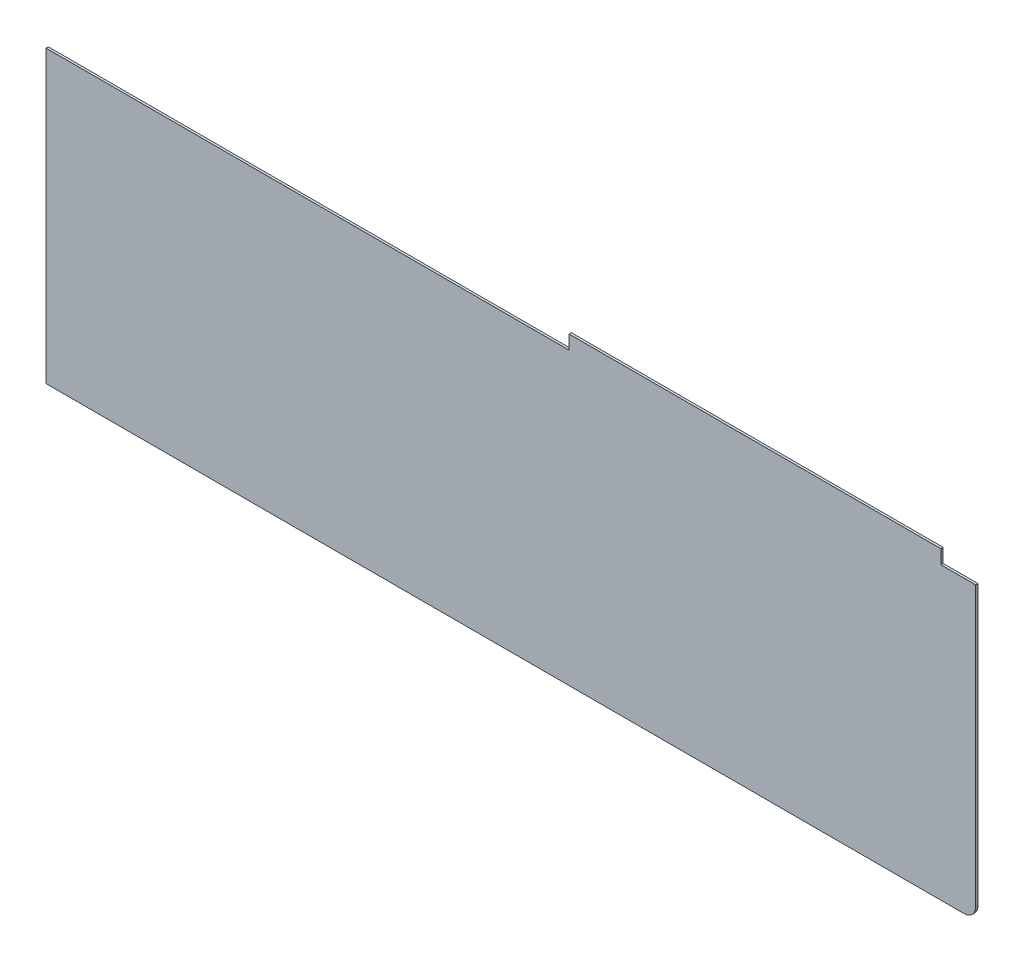
ISO-10303-21;
HEADER;
FILE_DESCRIPTION(('STEP AP214'),'2;1');
FILE_NAME('part.step','',(''),(''),'','','');
FILE_SCHEMA(('AUTOMOTIVE_DESIGN { 1 0 10303 214 1 1 1 1 }'));
ENDSEC;
DATA;
#1=APPLICATION_CONTEXT('core data for automotive mechanical design processes');
#2=APPLICATION_PROTOCOL_DEFINITION('international standard','automotive_design',2000,#1);
#3=PRODUCT_CONTEXT('',#1,'mechanical');
#4=PRODUCT('Part','Part','',(#3));
#5=PRODUCT_RELATED_PRODUCT_CATEGORY('part','',(#4));
#6=PRODUCT_DEFINITION_FORMATION('','',#4);
#7=PRODUCT_DEFINITION_CONTEXT('part definition',#1,'design');
#8=PRODUCT_DEFINITION('design','',#6,#7);
#9=PRODUCT_DEFINITION_SHAPE('','',#8);
#10=(LENGTH_UNIT() NAMED_UNIT(*) SI_UNIT(.MILLI.,.METRE.));
#11=(NAMED_UNIT(*) PLANE_ANGLE_UNIT() SI_UNIT($,.RADIAN.));
#12=(NAMED_UNIT(*) SI_UNIT($,.STERADIAN.) SOLID_ANGLE_UNIT());
#13=UNCERTAINTY_MEASURE_WITH_UNIT(LENGTH_MEASURE(1.E-05),#10,'distance_accuracy_value','');
#14=(GEOMETRIC_REPRESENTATION_CONTEXT(3) GLOBAL_UNCERTAINTY_ASSIGNED_CONTEXT((#13)) GLOBAL_UNIT_ASSIGNED_CONTEXT((#10,
#11,#12)) REPRESENTATION_CONTEXT('',''));
#15=CARTESIAN_POINT('',(0.,0.,0.));
#16=DIRECTION('',(0.,0.,1.));
#17=DIRECTION('',(1.,0.,0.));
#18=AXIS2_PLACEMENT_3D('',#15,#16,#17);
#19=CARTESIAN_POINT('',(-59.2830286329051,4.15023543117741,0.2));
#20=DIRECTION('',(0.,0.,1.));
#21=DIRECTION('',(1.,0.,0.));
#22=AXIS2_PLACEMENT_3D('',#19,#20,#21);
#23=PLANE('',#22);
#24=DIRECTION('',(1.,0.,0.));
#25=VECTOR('',#24,1.);
#26=CARTESIAN_POINT('',(-14.2830286329051,4.15023543117741,0.2));
#27=LINE('',#26,#25);
#28=CARTESIAN_POINT('',(-14.2830286329051,4.15023543117741,0.2));
#29=VERTEX_POINT('',#28);
#30=CARTESIAN_POINT('',(-59.2830286329051,4.15023543117741,0.2));
#31=VERTEX_POINT('',#30);
#32=EDGE_CURVE('E127',#29,#31,#27,.F.);
#33=ORIENTED_EDGE('',*,*,#32,.T.);
#34=DIRECTION('',(0.,1.,0.));
#35=VECTOR('',#34,1.);
#36=CARTESIAN_POINT('',(-59.2830286329051,4.15023543117741,0.2));
#37=LINE('',#36,#35);
#38=CARTESIAN_POINT('',(-59.2830286329051,-20.8497645688226,0.2));
#39=VERTEX_POINT('',#38);
#40=EDGE_CURVE('E103',#31,#39,#37,.F.);
#41=ORIENTED_EDGE('',*,*,#40,.T.);
#42=DIRECTION('',(1.,0.,0.));
#43=VECTOR('',#42,1.);
#44=CARTESIAN_POINT('',(-59.2830286329051,-20.8497645688226,0.2));
#45=LINE('',#44,#43);
#46=CARTESIAN_POINT('',(19.7169713670949,-20.8497645688226,0.2));
#47=VERTEX_POINT('',#46);
#48=EDGE_CURVE('E99',#39,#47,#45,.T.);
#49=ORIENTED_EDGE('',*,*,#48,.T.);
#50=CARTESIAN_POINT('',(19.7169713670949,-19.8497645688226,0.2));
#51=DIRECTION('',(0.,0.,-1.));
#52=DIRECTION('',(-1.,0.,0.));
#53=AXIS2_PLACEMENT_3D('',#50,#51,#52);
#54=CIRCLE('',#53,1.);
#55=CARTESIAN_POINT('',(20.7169713670949,-19.8497645688226,0.2));
#56=VERTEX_POINT('',#55);
#57=EDGE_CURVE('E19',#56,#47,#54,.T.);
#58=ORIENTED_EDGE('',*,*,#57,.F.);
#59=DIRECTION('',(0.,-1.,0.));
#60=VECTOR('',#59,1.);
#61=CARTESIAN_POINT('',(20.7169713670949,4.15023543117741,0.2));
#62=LINE('',#61,#60);
#63=CARTESIAN_POINT('',(20.7169713670949,4.15023543117741,0.2));
#64=VERTEX_POINT('',#63);
#65=EDGE_CURVE('E169',#56,#64,#62,.F.);
#66=ORIENTED_EDGE('',*,*,#65,.T.);
#67=DIRECTION('',(1.,0.,0.));
#68=VECTOR('',#67,1.);
#69=CARTESIAN_POINT('',(20.7169713670949,4.15023543117741,0.2));
#70=LINE('',#69,#68);
#71=CARTESIAN_POINT('',(17.7169713670949,4.15023543117741,0.2));
#72=VERTEX_POINT('',#71);
#73=EDGE_CURVE('E55',#64,#72,#70,.F.);
#74=ORIENTED_EDGE('',*,*,#73,.T.);
#75=DIRECTION('',(0.,1.,0.));
#76=VECTOR('',#75,1.);
#77=CARTESIAN_POINT('',(17.7169713670949,4.15023543117741,0.2));
#78=LINE('',#77,#76);
#79=CARTESIAN_POINT('',(17.7169713670949,5.35023543117741,0.2));
#80=VERTEX_POINT('',#79);
#81=EDGE_CURVE('E157',#72,#80,#78,.T.);
#82=ORIENTED_EDGE('',*,*,#81,.T.);
#83=DIRECTION('',(1.,0.,0.));
#84=VECTOR('',#83,1.);
#85=CARTESIAN_POINT('',(17.7169713670949,5.35023543117741,0.2));
#86=LINE('',#85,#84);
#87=CARTESIAN_POINT('',(-14.2830286329051,5.3502354311774,0.2));
#88=VERTEX_POINT('',#87);
#89=EDGE_CURVE('E146',#80,#88,#86,.F.);
#90=ORIENTED_EDGE('',*,*,#89,.T.);
#91=DIRECTION('',(0.,1.,0.));
#92=VECTOR('',#91,1.);
#93=CARTESIAN_POINT('',(-14.2830286329051,4.15023543117741,0.2));
#94=LINE('',#93,#92);
#95=EDGE_CURVE('E135',#88,#29,#94,.F.);
#96=ORIENTED_EDGE('',*,*,#95,.T.);
#97=EDGE_LOOP('',(#33,#41,#49,#58,#66,#74,#82,#90,#96));
#98=FACE_BOUND('',#97,.T.);
#99=ADVANCED_FACE('F16',(#98),#23,.T.);
#100=CARTESIAN_POINT('',(20.7169713670949,4.15023543117741,0.2));
#101=DIRECTION('',(0.,-1.,0.));
#102=DIRECTION('',(0.,0.,-1.));
#103=AXIS2_PLACEMENT_3D('',#100,#101,#102);
#104=PLANE('',#103);
#105=DIRECTION('',(0.,0.,1.));
#106=VECTOR('',#105,1.);
#107=CARTESIAN_POINT('',(17.7169713670949,4.15023543117741,0.2));
#108=LINE('',#107,#106);
#109=CARTESIAN_POINT('',(17.7169713670949,4.15023543117741,0.));
#110=VERTEX_POINT('',#109);
#111=EDGE_CURVE('E165',#110,#72,#108,.T.);
#112=ORIENTED_EDGE('',*,*,#111,.T.);
#113=ORIENTED_EDGE('',*,*,#73,.F.);
#114=DIRECTION('',(0.,0.,1.));
#115=VECTOR('',#114,1.);
#116=CARTESIAN_POINT('',(20.7169713670949,4.15023543117741,0.2));
#117=LINE('',#116,#115);
#118=CARTESIAN_POINT('',(20.7169713670949,4.15023543117741,0.));
#119=VERTEX_POINT('',#118);
#120=EDGE_CURVE('E196',#64,#119,#117,.F.);
#121=ORIENTED_EDGE('',*,*,#120,.T.);
#122=DIRECTION('',(1.,0.,0.));
#123=VECTOR('',#122,1.);
#124=CARTESIAN_POINT('',(-59.2830286329051,4.15023543117741,0.));
#125=LINE('',#124,#123);
#126=EDGE_CURVE('E162',#119,#110,#125,.F.);
#127=ORIENTED_EDGE('',*,*,#126,.T.);
#128=EDGE_LOOP('',(#112,#113,#121,#127));
#129=FACE_BOUND('',#128,.T.);
#130=ADVANCED_FACE('F210',(#129),#104,.F.);
#131=CARTESIAN_POINT('',(17.7169713670949,4.15023543117741,0.2));
#132=DIRECTION('',(-1.,0.,0.));
#133=DIRECTION('',(0.,0.,1.));
#134=AXIS2_PLACEMENT_3D('',#131,#132,#133);
#135=PLANE('',#134);
#136=DIRECTION('',(0.,0.,1.));
#137=VECTOR('',#136,1.);
#138=CARTESIAN_POINT('',(17.7169713670949,5.35023543117741,0.2));
#139=LINE('',#138,#137);
#140=CARTESIAN_POINT('',(17.7169713670949,5.35023543117741,0.));
#141=VERTEX_POINT('',#140);
#142=EDGE_CURVE('E154',#141,#80,#139,.T.);
#143=ORIENTED_EDGE('',*,*,#142,.T.);
#144=ORIENTED_EDGE('',*,*,#81,.F.);
#145=ORIENTED_EDGE('',*,*,#111,.F.);
#146=DIRECTION('',(0.,1.,0.));
#147=VECTOR('',#146,1.);
#148=CARTESIAN_POINT('',(17.7169713670949,4.15023543117741,0.));
#149=LINE('',#148,#147);
#150=EDGE_CURVE('E151',#110,#141,#149,.T.);
#151=ORIENTED_EDGE('',*,*,#150,.T.);
#152=EDGE_LOOP('',(#143,#144,#145,#151));
#153=FACE_BOUND('',#152,.T.);
#154=ADVANCED_FACE('F215',(#153),#135,.F.);
#155=CARTESIAN_POINT('',(17.7169713670949,5.35023543117741,0.2));
#156=DIRECTION('',(0.,-1.,0.));
#157=DIRECTION('',(1.,0.,0.));
#158=AXIS2_PLACEMENT_3D('',#155,#156,#157);
#159=PLANE('',#158);
#160=DIRECTION('',(0.,0.,-1.));
#161=VECTOR('',#160,1.);
#162=CARTESIAN_POINT('',(-14.2830286329051,5.3502354311774,0.2));
#163=LINE('',#162,#161);
#164=CARTESIAN_POINT('',(-14.2830286329051,5.35023543117741,0.));
#165=VERTEX_POINT('',#164);
#166=EDGE_CURVE('E143',#165,#88,#163,.F.);
#167=ORIENTED_EDGE('',*,*,#166,.T.);
#168=ORIENTED_EDGE('',*,*,#89,.F.);
#169=ORIENTED_EDGE('',*,*,#142,.F.);
#170=DIRECTION('',(1.,0.,0.));
#171=VECTOR('',#170,1.);
#172=CARTESIAN_POINT('',(-59.2830286329051,5.35023543117741,0.));
#173=LINE('',#172,#171);
#174=EDGE_CURVE('E140',#141,#165,#173,.F.);
#175=ORIENTED_EDGE('',*,*,#174,.T.);
#176=EDGE_LOOP('',(#167,#168,#169,#175));
#177=FACE_BOUND('',#176,.T.);
#178=ADVANCED_FACE('F220',(#177),#159,.F.);
#179=CARTESIAN_POINT('',(-14.2830286329051,4.15023543117741,0.2));
#180=DIRECTION('',(1.,0.,0.));
#181=DIRECTION('',(0.,0.,-1.));
#182=AXIS2_PLACEMENT_3D('',#179,#180,#181);
#183=PLANE('',#182);
#184=DIRECTION('',(0.,0.,1.));
#185=VECTOR('',#184,1.);
#186=CARTESIAN_POINT('',(-14.2830286329051,4.15023543117741,0.2));
#187=LINE('',#186,#185);
#188=CARTESIAN_POINT('',(-14.2830286329051,4.15023543117741,0.));
#189=VERTEX_POINT('',#188);
#190=EDGE_CURVE('E132',#189,#29,#187,.T.);
#191=ORIENTED_EDGE('',*,*,#190,.T.);
#192=ORIENTED_EDGE('',*,*,#95,.F.);
#193=ORIENTED_EDGE('',*,*,#166,.F.);
#194=DIRECTION('',(0.,1.,0.));
#195=VECTOR('',#194,1.);
#196=CARTESIAN_POINT('',(-14.2830286329051,4.15023543117741,0.));
#197=LINE('',#196,#195);
#198=EDGE_CURVE('E119',#165,#189,#197,.F.);
#199=ORIENTED_EDGE('',*,*,#198,.T.);
#200=EDGE_LOOP('',(#191,#192,#193,#199));
#201=FACE_BOUND('',#200,.T.);
#202=ADVANCED_FACE('F222',(#201),#183,.F.);
#203=CARTESIAN_POINT('',(-14.2830286329051,4.15023543117741,0.2));
#204=DIRECTION('',(0.,-1.,0.));
#205=DIRECTION('',(1.,0.,0.));
#206=AXIS2_PLACEMENT_3D('',#203,#204,#205);
#207=PLANE('',#206);
#208=DIRECTION('',(0.,0.,-1.));
#209=VECTOR('',#208,1.);
#210=CARTESIAN_POINT('',(-59.2830286329051,4.15023543117741,0.2));
#211=LINE('',#210,#209);
#212=CARTESIAN_POINT('',(-59.2830286329051,4.15023543117741,0.));
#213=VERTEX_POINT('',#212);
#214=EDGE_CURVE('E116',#213,#31,#211,.F.);
#215=ORIENTED_EDGE('',*,*,#214,.T.);
#216=ORIENTED_EDGE('',*,*,#32,.F.);
#217=ORIENTED_EDGE('',*,*,#190,.F.);
#218=DIRECTION('',(1.,0.,0.));
#219=VECTOR('',#218,1.);
#220=CARTESIAN_POINT('',(-59.2830286329051,4.15023543117741,0.));
#221=LINE('',#220,#219);
#222=EDGE_CURVE('E117',#189,#213,#221,.F.);
#223=ORIENTED_EDGE('',*,*,#222,.T.);
#224=EDGE_LOOP('',(#215,#216,#217,#223));
#225=FACE_BOUND('',#224,.T.);
#226=ADVANCED_FACE('F224',(#225),#207,.F.);
#227=CARTESIAN_POINT('',(-59.2830286329051,4.15023543117741,0.2));
#228=DIRECTION('',(1.,0.,0.));
#229=DIRECTION('',(0.,0.,-1.));
#230=AXIS2_PLACEMENT_3D('',#227,#228,#229);
#231=PLANE('',#230);
#232=DIRECTION('',(0.,0.,1.));
#233=VECTOR('',#232,1.);
#234=CARTESIAN_POINT('',(-59.2830286329051,-20.8497645688226,0.2));
#235=LINE('',#234,#233);
#236=CARTESIAN_POINT('',(-59.2830286329051,-20.8497645688226,0.));
#237=VERTEX_POINT('',#236);
#238=EDGE_CURVE('E94',#237,#39,#235,.T.);
#239=ORIENTED_EDGE('',*,*,#238,.T.);
#240=ORIENTED_EDGE('',*,*,#40,.F.);
#241=ORIENTED_EDGE('',*,*,#214,.F.);
#242=DIRECTION('',(0.,1.,0.));
#243=VECTOR('',#242,1.);
#244=CARTESIAN_POINT('',(-59.2830286329051,4.15023543117741,0.));
#245=LINE('',#244,#243);
#246=EDGE_CURVE('E110',#213,#237,#245,.F.);
#247=ORIENTED_EDGE('',*,*,#246,.T.);
#248=EDGE_LOOP('',(#239,#240,#241,#247));
#249=FACE_BOUND('',#248,.T.);
#250=ADVANCED_FACE('F114',(#249),#231,.F.);
#251=CARTESIAN_POINT('',(-59.2830286329051,-20.8497645688226,0.2));
#252=DIRECTION('',(0.,1.,0.));
#253=DIRECTION('',(0.,0.,1.));
#254=AXIS2_PLACEMENT_3D('',#251,#252,#253);
#255=PLANE('',#254);
#256=DIRECTION('',(0.,0.,-1.));
#257=VECTOR('',#256,1.);
#258=CARTESIAN_POINT('',(19.7169713670949,-20.8497645688226,0.2));
#259=LINE('',#258,#257);
#260=CARTESIAN_POINT('',(19.7169713670949,-20.8497645688226,0.));
#261=VERTEX_POINT('',#260);
#262=EDGE_CURVE('E195',#47,#261,#259,.T.);
#263=ORIENTED_EDGE('',*,*,#262,.F.);
#264=ORIENTED_EDGE('',*,*,#48,.F.);
#265=ORIENTED_EDGE('',*,*,#238,.F.);
#266=DIRECTION('',(1.,0.,0.));
#267=VECTOR('',#266,1.);
#268=CARTESIAN_POINT('',(-59.2830286329051,-20.8497645688226,0.));
#269=LINE('',#268,#267);
#270=EDGE_CURVE('E98',#237,#261,#269,.T.);
#271=ORIENTED_EDGE('',*,*,#270,.T.);
#272=EDGE_LOOP('',(#263,#264,#265,#271));
#273=FACE_BOUND('',#272,.T.);
#274=ADVANCED_FACE('F97',(#273),#255,.F.);
#275=CARTESIAN_POINT('',(19.7169713670949,-19.8497645688226,0.2));
#276=DIRECTION('',(0.,0.,-1.));
#277=DIRECTION('',(-1.,0.,0.));
#278=AXIS2_PLACEMENT_3D('',#275,#276,#277);
#279=CYLINDRICAL_SURFACE('',#278,1.);
#280=CARTESIAN_POINT('',(19.7169713670949,-19.8497645688226,0.));
#281=DIRECTION('',(0.,0.,-1.));
#282=DIRECTION('',(-1.,0.,0.));
#283=AXIS2_PLACEMENT_3D('',#280,#281,#282);
#284=CIRCLE('',#283,1.);
#285=CARTESIAN_POINT('',(20.7169713670949,-19.8497645688226,0.));
#286=VERTEX_POINT('',#285);
#287=EDGE_CURVE('E25',#261,#286,#284,.F.);
#288=ORIENTED_EDGE('',*,*,#287,.T.);
#289=DIRECTION('',(0.,0.,1.));
#290=VECTOR('',#289,1.);
#291=CARTESIAN_POINT('',(20.7169713670949,-19.8497645688226,0.2));
#292=LINE('',#291,#290);
#293=EDGE_CURVE('E33',#286,#56,#292,.T.);
#294=ORIENTED_EDGE('',*,*,#293,.T.);
#295=ORIENTED_EDGE('',*,*,#57,.T.);
#296=ORIENTED_EDGE('',*,*,#262,.T.);
#297=EDGE_LOOP('',(#288,#294,#295,#296));
#298=FACE_BOUND('',#297,.T.);
#299=ADVANCED_FACE('F194',(#298),#279,.T.);
#300=CARTESIAN_POINT('',(20.7169713670949,4.15023543117741,0.2));
#301=DIRECTION('',(-1.,0.,0.));
#302=DIRECTION('',(0.,-1.,0.));
#303=AXIS2_PLACEMENT_3D('',#300,#301,#302);
#304=PLANE('',#303);
#305=ORIENTED_EDGE('',*,*,#293,.F.);
#306=DIRECTION('',(0.,1.,0.));
#307=VECTOR('',#306,1.);
#308=CARTESIAN_POINT('',(20.7169713670949,4.15023543117741,0.));
#309=LINE('',#308,#307);
#310=EDGE_CURVE('E10',#286,#119,#309,.T.);
#311=ORIENTED_EDGE('',*,*,#310,.T.);
#312=ORIENTED_EDGE('',*,*,#120,.F.);
#313=ORIENTED_EDGE('',*,*,#65,.F.);
#314=EDGE_LOOP('',(#305,#311,#312,#313));
#315=FACE_BOUND('',#314,.T.);
#316=ADVANCED_FACE('F236',(#315),#304,.F.);
#317=CARTESIAN_POINT('',(-59.2830286329051,4.15023543117741,0.));
#318=DIRECTION('',(0.,0.,1.));
#319=DIRECTION('',(1.,0.,0.));
#320=AXIS2_PLACEMENT_3D('',#317,#318,#319);
#321=PLANE('',#320);
#322=ORIENTED_EDGE('',*,*,#287,.F.);
#323=ORIENTED_EDGE('',*,*,#270,.F.);
#324=ORIENTED_EDGE('',*,*,#246,.F.);
#325=ORIENTED_EDGE('',*,*,#222,.F.);
#326=ORIENTED_EDGE('',*,*,#198,.F.);
#327=ORIENTED_EDGE('',*,*,#174,.F.);
#328=ORIENTED_EDGE('',*,*,#150,.F.);
#329=ORIENTED_EDGE('',*,*,#126,.F.);
#330=ORIENTED_EDGE('',*,*,#310,.F.);
#331=EDGE_LOOP('',(#322,#323,#324,#325,#326,#327,#328,#329,#330));
#332=FACE_BOUND('',#331,.T.);
#333=ADVANCED_FACE('F108',(#332),#321,.F.);
#334=CLOSED_SHELL('',(#99,#130,#154,#178,#202,#226,#250,#274,#299,#316,#333));
#335=MANIFOLD_SOLID_BREP('B1',#334);
#336=ADVANCED_BREP_SHAPE_REPRESENTATION('',(#18,#335),#14);
#337=SHAPE_DEFINITION_REPRESENTATION(#9,#336);
ENDSEC;
END-ISO-10303-21;
